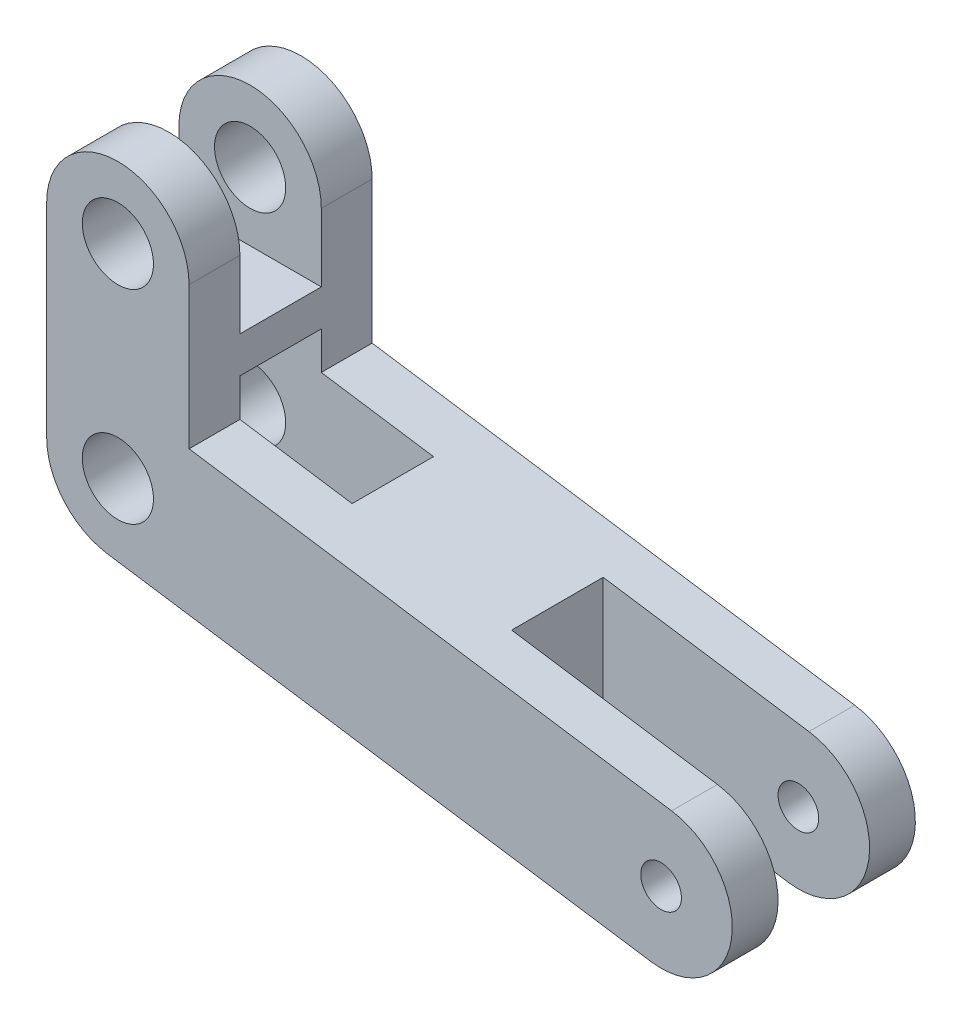
ISO-10303-21;
HEADER;
FILE_DESCRIPTION(('STEP AP214'),'2;1');
FILE_NAME('part.step','',(''),(''),'','','');
FILE_SCHEMA(('AUTOMOTIVE_DESIGN { 1 0 10303 214 1 1 1 1 }'));
ENDSEC;
DATA;
#1=APPLICATION_CONTEXT('core data for automotive mechanical design processes');
#2=APPLICATION_PROTOCOL_DEFINITION('international standard','automotive_design',2000,#1);
#3=PRODUCT_CONTEXT('',#1,'mechanical');
#4=PRODUCT('Part','Part','',(#3));
#5=PRODUCT_RELATED_PRODUCT_CATEGORY('part','',(#4));
#6=PRODUCT_DEFINITION_FORMATION('','',#4);
#7=PRODUCT_DEFINITION_CONTEXT('part definition',#1,'design');
#8=PRODUCT_DEFINITION('design','',#6,#7);
#9=PRODUCT_DEFINITION_SHAPE('','',#8);
#10=(LENGTH_UNIT() NAMED_UNIT(*) SI_UNIT(.MILLI.,.METRE.));
#11=(NAMED_UNIT(*) PLANE_ANGLE_UNIT() SI_UNIT($,.RADIAN.));
#12=(NAMED_UNIT(*) SI_UNIT($,.STERADIAN.) SOLID_ANGLE_UNIT());
#13=UNCERTAINTY_MEASURE_WITH_UNIT(LENGTH_MEASURE(1.E-05),#10,'distance_accuracy_value','');
#14=(GEOMETRIC_REPRESENTATION_CONTEXT(3) GLOBAL_UNCERTAINTY_ASSIGNED_CONTEXT((#13)) GLOBAL_UNIT_ASSIGNED_CONTEXT((#10,
#11,#12)) REPRESENTATION_CONTEXT('',''));
#15=CARTESIAN_POINT('',(0.,0.,0.));
#16=DIRECTION('',(0.,0.,1.));
#17=DIRECTION('',(1.,0.,0.));
#18=AXIS2_PLACEMENT_3D('',#15,#16,#17);
#19=CARTESIAN_POINT('',(26.7020598456374,-4.,4.5));
#20=DIRECTION('',(0.,0.,-1.));
#21=DIRECTION('',(-1.,0.,0.));
#22=AXIS2_PLACEMENT_3D('',#19,#20,#21);
#23=CYLINDRICAL_SURFACE('',#22,3.5);
#24=CARTESIAN_POINT('',(26.7020598456374,-4.,-2.25));
#25=DIRECTION('',(0.,0.,1.));
#26=DIRECTION('',(1.,0.,0.));
#27=AXIS2_PLACEMENT_3D('',#24,#25,#26);
#28=CIRCLE('',#27,3.5);
#29=CARTESIAN_POINT('',(26.1835413271189,-7.46137812813818,-2.25));
#30=VERTEX_POINT('',#29);
#31=CARTESIAN_POINT('',(27.2205783641559,-0.53862187186182,-2.25));
#32=VERTEX_POINT('',#31);
#33=EDGE_CURVE('E219',#30,#32,#28,.T.);
#34=ORIENTED_EDGE('',*,*,#33,.F.);
#35=DIRECTION('',(0.,0.,-1.));
#36=VECTOR('',#35,1.);
#37=CARTESIAN_POINT('',(26.1835413271189,-7.46137812813818,4.5));
#38=LINE('',#37,#36);
#39=CARTESIAN_POINT('',(26.1835413271189,-7.46137812813818,-4.5));
#40=VERTEX_POINT('',#39);
#41=EDGE_CURVE('E323',#30,#40,#38,.T.);
#42=ORIENTED_EDGE('',*,*,#41,.T.);
#43=CARTESIAN_POINT('',(26.7020598456374,-4.,-4.5));
#44=DIRECTION('',(0.,0.,1.));
#45=DIRECTION('',(1.,0.,0.));
#46=AXIS2_PLACEMENT_3D('',#43,#44,#45);
#47=CIRCLE('',#46,3.5);
#48=CARTESIAN_POINT('',(27.2205783641559,-0.538621871861821,-4.5));
#49=VERTEX_POINT('',#48);
#50=EDGE_CURVE('E304',#40,#49,#47,.T.);
#51=ORIENTED_EDGE('',*,*,#50,.T.);
#52=DIRECTION('',(0.,0.,-1.));
#53=VECTOR('',#52,1.);
#54=CARTESIAN_POINT('',(27.2205783641559,-0.538621871861821,4.5));
#55=LINE('',#54,#53);
#56=EDGE_CURVE('E366',#32,#49,#55,.T.);
#57=ORIENTED_EDGE('',*,*,#56,.F.);
#58=EDGE_LOOP('',(#34,#42,#51,#57));
#59=FACE_BOUND('',#58,.T.);
#60=ADVANCED_FACE('F41',(#59),#23,.T.);
#61=CARTESIAN_POINT('',(27.2205783641559,-0.538621871861821,4.5));
#62=DIRECTION('',(-0.148148148148148,-0.988965179468051,0.));
#63=DIRECTION('',(0.988965179468051,-0.148148148148148,0.));
#64=AXIS2_PLACEMENT_3D('',#61,#62,#63);
#65=PLANE('',#64);
#66=DIRECTION('',(-0.988965179468051,0.148148148148148,0.));
#67=VECTOR('',#66,1.);
#68=CARTESIAN_POINT('',(27.2205783641559,-0.538621871861821,-2.25));
#69=LINE('',#68,#67);
#70=CARTESIAN_POINT('',(17.108650588572,0.976156813234416,-2.25));
#71=VERTEX_POINT('',#70);
#72=EDGE_CURVE('E201',#32,#71,#69,.T.);
#73=ORIENTED_EDGE('',*,*,#72,.F.);
#74=ORIENTED_EDGE('',*,*,#56,.T.);
#75=DIRECTION('',(-0.988965179468051,0.148148148148148,0.));
#76=VECTOR('',#75,1.);
#77=CARTESIAN_POINT('',(27.2205783641559,-0.538621871861821,-4.5));
#78=LINE('',#77,#76);
#79=CARTESIAN_POINT('',(3.5,3.01474869224938,-4.5));
#80=VERTEX_POINT('',#79);
#81=EDGE_CURVE('E326',#49,#80,#78,.T.);
#82=ORIENTED_EDGE('',*,*,#81,.T.);
#83=DIRECTION('',(0.,0.,-1.));
#84=VECTOR('',#83,1.);
#85=CARTESIAN_POINT('',(3.5,3.01474869224938,4.5));
#86=LINE('',#85,#84);
#87=CARTESIAN_POINT('',(3.5,3.01474869224938,-2.));
#88=VERTEX_POINT('',#87);
#89=EDGE_CURVE('E362',#88,#80,#86,.T.);
#90=ORIENTED_EDGE('',*,*,#89,.F.);
#91=DIRECTION('',(0.988965179468051,-0.148148148148148,0.));
#92=VECTOR('',#91,1.);
#93=CARTESIAN_POINT('',(27.2205783641559,-0.538621871861821,-2.));
#94=LINE('',#93,#92);
#95=CARTESIAN_POINT('',(9.01483292771079,2.18862022731572,-2.));
#96=VERTEX_POINT('',#95);
#97=EDGE_CURVE('E279',#88,#96,#94,.T.);
#98=ORIENTED_EDGE('',*,*,#97,.T.);
#99=DIRECTION('',(0.,0.,1.));
#100=VECTOR('',#99,1.);
#101=CARTESIAN_POINT('',(9.01483292771079,2.18862022731572,4.5));
#102=LINE('',#101,#100);
#103=CARTESIAN_POINT('',(9.01483292771079,2.18862022731572,2.));
#104=VERTEX_POINT('',#103);
#105=EDGE_CURVE('E282',#96,#104,#102,.T.);
#106=ORIENTED_EDGE('',*,*,#105,.T.);
#107=DIRECTION('',(0.988965179468051,-0.148148148148148,0.));
#108=VECTOR('',#107,1.);
#109=CARTESIAN_POINT('',(27.2205783641559,-0.538621871861821,2.));
#110=LINE('',#109,#108);
#111=CARTESIAN_POINT('',(3.5,3.01474869224938,2.));
#112=VERTEX_POINT('',#111);
#113=EDGE_CURVE('E264',#112,#104,#110,.T.);
#114=ORIENTED_EDGE('',*,*,#113,.F.);
#115=CARTESIAN_POINT('',(3.5,3.01474869224938,4.5));
#116=VERTEX_POINT('',#115);
#117=EDGE_CURVE('E363',#116,#112,#86,.T.);
#118=ORIENTED_EDGE('',*,*,#117,.F.);
#119=DIRECTION('',(-0.988965179468051,0.148148148148148,0.));
#120=VECTOR('',#119,1.);
#121=CARTESIAN_POINT('',(27.2205783641559,-0.538621871861821,4.5));
#122=LINE('',#121,#120);
#123=CARTESIAN_POINT('',(27.2205783641559,-0.538621871861821,4.5));
#124=VERTEX_POINT('',#123);
#125=EDGE_CURVE('E310',#124,#116,#122,.T.);
#126=ORIENTED_EDGE('',*,*,#125,.F.);
#127=CARTESIAN_POINT('',(27.2205783641559,-0.53862187186182,2.25));
#128=VERTEX_POINT('',#127);
#129=EDGE_CURVE('E210',#124,#128,#55,.T.);
#130=ORIENTED_EDGE('',*,*,#129,.T.);
#131=DIRECTION('',(-0.988965179468051,0.148148148148148,0.));
#132=VECTOR('',#131,1.);
#133=CARTESIAN_POINT('',(27.2205783641559,-0.538621871861821,2.25));
#134=LINE('',#133,#132);
#135=CARTESIAN_POINT('',(17.108650588572,0.976156813234416,2.25));
#136=VERTEX_POINT('',#135);
#137=EDGE_CURVE('E204',#128,#136,#134,.T.);
#138=ORIENTED_EDGE('',*,*,#137,.T.);
#139=DIRECTION('',(0.,0.,-1.));
#140=VECTOR('',#139,1.);
#141=CARTESIAN_POINT('',(17.108650588572,0.976156813234419,4.5));
#142=LINE('',#141,#140);
#143=EDGE_CURVE('E191',#136,#71,#142,.T.);
#144=ORIENTED_EDGE('',*,*,#143,.T.);
#145=EDGE_LOOP('',(#73,#74,#82,#90,#98,#106,#114,#118,#126,#130,#138,#144));
#146=FACE_BOUND('',#145,.T.);
#147=ADVANCED_FACE('F208',(#146),#65,.F.);
#148=CARTESIAN_POINT('',(26.1835413271189,-7.46137812813818,4.5));
#149=DIRECTION('',(0.148148148148148,0.988965179468051,0.));
#150=DIRECTION('',(-0.988965179468051,0.148148148148148,0.));
#151=AXIS2_PLACEMENT_3D('',#148,#149,#150);
#152=PLANE('',#151);
#153=DIRECTION('',(0.988965179468051,-0.148148148148148,0.));
#154=VECTOR('',#153,1.);
#155=CARTESIAN_POINT('',(26.1835413271189,-7.46137812813818,-2.25));
#156=LINE('',#155,#154);
#157=CARTESIAN_POINT('',(17.108650588572,-6.10194881204674,-2.25));
#158=VERTEX_POINT('',#157);
#159=EDGE_CURVE('E214',#158,#30,#156,.T.);
#160=ORIENTED_EDGE('',*,*,#159,.F.);
#161=DIRECTION('',(0.,0.,1.));
#162=VECTOR('',#161,1.);
#163=CARTESIAN_POINT('',(17.108650588572,-6.10194881204674,4.5));
#164=LINE('',#163,#162);
#165=CARTESIAN_POINT('',(17.108650588572,-6.10194881204674,2.25));
#166=VERTEX_POINT('',#165);
#167=EDGE_CURVE('E11',#158,#166,#164,.T.);
#168=ORIENTED_EDGE('',*,*,#167,.T.);
#169=DIRECTION('',(0.988965179468051,-0.148148148148148,0.));
#170=VECTOR('',#169,1.);
#171=CARTESIAN_POINT('',(26.1835413271189,-7.46137812813818,2.25));
#172=LINE('',#171,#170);
#173=CARTESIAN_POINT('',(26.1835413271189,-7.46137812813818,2.25));
#174=VERTEX_POINT('',#173);
#175=EDGE_CURVE('E205',#166,#174,#172,.T.);
#176=ORIENTED_EDGE('',*,*,#175,.T.);
#177=CARTESIAN_POINT('',(26.1835413271189,-7.46137812813818,4.5));
#178=VERTEX_POINT('',#177);
#179=EDGE_CURVE('E343',#178,#174,#38,.T.);
#180=ORIENTED_EDGE('',*,*,#179,.F.);
#181=DIRECTION('',(0.988965179468051,-0.148148148148148,0.));
#182=VECTOR('',#181,1.);
#183=CARTESIAN_POINT('',(26.1835413271189,-7.46137812813818,4.5));
#184=LINE('',#183,#182);
#185=CARTESIAN_POINT('',(-0.518518518518519,-3.46137812813818,4.5));
#186=VERTEX_POINT('',#185);
#187=EDGE_CURVE('E321',#186,#178,#184,.T.);
#188=ORIENTED_EDGE('',*,*,#187,.F.);
#189=DIRECTION('',(0.,0.,-1.));
#190=VECTOR('',#189,1.);
#191=CARTESIAN_POINT('',(-0.518518518518519,-3.46137812813818,4.5));
#192=LINE('',#191,#190);
#193=CARTESIAN_POINT('',(-0.518518518518522,-3.46137812813818,2.));
#194=VERTEX_POINT('',#193);
#195=EDGE_CURVE('E347',#186,#194,#192,.T.);
#196=ORIENTED_EDGE('',*,*,#195,.T.);
#197=DIRECTION('',(-0.988965179468051,0.148148148148148,0.));
#198=VECTOR('',#197,1.);
#199=CARTESIAN_POINT('',(26.1835413271189,-7.46137812813818,2.));
#200=LINE('',#199,#198);
#201=CARTESIAN_POINT('',(9.01483292771079,-4.88948539796544,2.));
#202=VERTEX_POINT('',#201);
#203=EDGE_CURVE('E256',#202,#194,#200,.T.);
#204=ORIENTED_EDGE('',*,*,#203,.F.);
#205=DIRECTION('',(0.,0.,-1.));
#206=VECTOR('',#205,1.);
#207=CARTESIAN_POINT('',(9.01483292771079,-4.88948539796544,4.5));
#208=LINE('',#207,#206);
#209=CARTESIAN_POINT('',(9.01483292771079,-4.88948539796544,-2.));
#210=VERTEX_POINT('',#209);
#211=EDGE_CURVE('E368',#202,#210,#208,.T.);
#212=ORIENTED_EDGE('',*,*,#211,.T.);
#213=DIRECTION('',(-0.988965179468051,0.148148148148148,0.));
#214=VECTOR('',#213,1.);
#215=CARTESIAN_POINT('',(26.1835413271189,-7.46137812813818,-2.));
#216=LINE('',#215,#214);
#217=CARTESIAN_POINT('',(-0.518518518518522,-3.46137812813818,-2.));
#218=VERTEX_POINT('',#217);
#219=EDGE_CURVE('E267',#210,#218,#216,.T.);
#220=ORIENTED_EDGE('',*,*,#219,.T.);
#221=CARTESIAN_POINT('',(-0.518518518518519,-3.46137812813818,-4.5));
#222=VERTEX_POINT('',#221);
#223=EDGE_CURVE('E346',#218,#222,#192,.T.);
#224=ORIENTED_EDGE('',*,*,#223,.T.);
#225=DIRECTION('',(0.988965179468051,-0.148148148148148,0.));
#226=VECTOR('',#225,1.);
#227=CARTESIAN_POINT('',(26.1835413271189,-7.46137812813818,-4.5));
#228=LINE('',#227,#226);
#229=EDGE_CURVE('E311',#222,#40,#228,.T.);
#230=ORIENTED_EDGE('',*,*,#229,.T.);
#231=ORIENTED_EDGE('',*,*,#41,.F.);
#232=EDGE_LOOP('',(#160,#168,#176,#180,#188,#196,#204,#212,#220,#224,#230,#231));
#233=FACE_BOUND('',#232,.T.);
#234=ADVANCED_FACE('F395',(#233),#152,.F.);
#235=CARTESIAN_POINT('',(26.7020598456374,-4.,4.5));
#236=DIRECTION('',(0.,0.,-1.));
#237=DIRECTION('',(-1.,0.,0.));
#238=AXIS2_PLACEMENT_3D('',#235,#236,#237);
#239=CYLINDRICAL_SURFACE('',#238,0.999999999999998);
#240=CARTESIAN_POINT('',(26.7020598456374,-4.,-4.5));
#241=DIRECTION('',(0.,0.,1.));
#242=DIRECTION('',(1.,0.,0.));
#243=AXIS2_PLACEMENT_3D('',#240,#241,#242);
#244=CIRCLE('',#243,0.999999999999998);
#245=CARTESIAN_POINT('',(27.7020598456374,-4.,-4.5));
#246=VERTEX_POINT('',#245);
#247=EDGE_CURVE('E292',#246,#246,#244,.T.);
#248=ORIENTED_EDGE('',*,*,#247,.F.);
#249=EDGE_LOOP('',(#248));
#250=FACE_BOUND('',#249,.T.);
#251=CARTESIAN_POINT('',(26.7020598456374,-4.,-2.25));
#252=DIRECTION('',(0.,0.,1.));
#253=DIRECTION('',(1.,0.,0.));
#254=AXIS2_PLACEMENT_3D('',#251,#252,#253);
#255=CIRCLE('',#254,0.999999999999998);
#256=CARTESIAN_POINT('',(27.7020598456374,-4.,-2.25));
#257=VERTEX_POINT('',#256);
#258=EDGE_CURVE('E211',#257,#257,#255,.T.);
#259=ORIENTED_EDGE('',*,*,#258,.T.);
#260=EDGE_LOOP('',(#259));
#261=FACE_BOUND('',#260,.T.);
#262=ADVANCED_FACE('F470',(#250,#261),#239,.F.);
#263=CARTESIAN_POINT('',(3.5,10.,4.5));
#264=DIRECTION('',(-1.,0.,0.));
#265=DIRECTION('',(0.,-1.,0.));
#266=AXIS2_PLACEMENT_3D('',#263,#264,#265);
#267=PLANE('',#266);
#268=DIRECTION('',(0.,1.,0.));
#269=VECTOR('',#268,1.);
#270=CARTESIAN_POINT('',(3.5,16.4698635435501,-2.));
#271=LINE('',#270,#269);
#272=CARTESIAN_POINT('',(3.5,6.65669603838257,-2.));
#273=VERTEX_POINT('',#272);
#274=CARTESIAN_POINT('',(3.5,10.,-2.));
#275=VERTEX_POINT('',#274);
#276=EDGE_CURVE('E224',#273,#275,#271,.T.);
#277=ORIENTED_EDGE('',*,*,#276,.F.);
#278=DIRECTION('',(0.,0.,1.));
#279=VECTOR('',#278,1.);
#280=CARTESIAN_POINT('',(3.5,6.65669603838257,-2.));
#281=LINE('',#280,#279);
#282=CARTESIAN_POINT('',(3.5,6.65669603838257,2.));
#283=VERTEX_POINT('',#282);
#284=EDGE_CURVE('E227',#273,#283,#281,.T.);
#285=ORIENTED_EDGE('',*,*,#284,.T.);
#286=DIRECTION('',(0.,1.,0.));
#287=VECTOR('',#286,1.);
#288=CARTESIAN_POINT('',(3.5,16.4698635435501,2.));
#289=LINE('',#288,#287);
#290=CARTESIAN_POINT('',(3.5,10.,2.));
#291=VERTEX_POINT('',#290);
#292=EDGE_CURVE('E225',#283,#291,#289,.T.);
#293=ORIENTED_EDGE('',*,*,#292,.T.);
#294=DIRECTION('',(0.,0.,-1.));
#295=VECTOR('',#294,1.);
#296=CARTESIAN_POINT('',(3.5,10.,4.5));
#297=LINE('',#296,#295);
#298=CARTESIAN_POINT('',(3.5,10.,4.5));
#299=VERTEX_POINT('',#298);
#300=EDGE_CURVE('E359',#299,#291,#297,.T.);
#301=ORIENTED_EDGE('',*,*,#300,.F.);
#302=DIRECTION('',(0.,1.,0.));
#303=VECTOR('',#302,1.);
#304=CARTESIAN_POINT('',(3.5,10.,4.5));
#305=LINE('',#304,#303);
#306=EDGE_CURVE('E313',#116,#299,#305,.T.);
#307=ORIENTED_EDGE('',*,*,#306,.F.);
#308=ORIENTED_EDGE('',*,*,#117,.T.);
#309=DIRECTION('',(0.,-1.,0.));
#310=VECTOR('',#309,1.);
#311=CARTESIAN_POINT('',(3.5,10.,2.));
#312=LINE('',#311,#310);
#313=CARTESIAN_POINT('',(3.5,4.86934920884361,2.));
#314=VERTEX_POINT('',#313);
#315=EDGE_CURVE('E262',#314,#112,#312,.T.);
#316=ORIENTED_EDGE('',*,*,#315,.F.);
#317=DIRECTION('',(0.,0.,-1.));
#318=VECTOR('',#317,1.);
#319=CARTESIAN_POINT('',(3.5,4.86934920884361,4.5));
#320=LINE('',#319,#318);
#321=CARTESIAN_POINT('',(3.5,4.86934920884361,-2.));
#322=VERTEX_POINT('',#321);
#323=EDGE_CURVE('E285',#314,#322,#320,.T.);
#324=ORIENTED_EDGE('',*,*,#323,.T.);
#325=DIRECTION('',(0.,-1.,0.));
#326=VECTOR('',#325,1.);
#327=CARTESIAN_POINT('',(3.5,10.,-2.));
#328=LINE('',#327,#326);
#329=EDGE_CURVE('E276',#322,#88,#328,.T.);
#330=ORIENTED_EDGE('',*,*,#329,.T.);
#331=ORIENTED_EDGE('',*,*,#89,.T.);
#332=DIRECTION('',(0.,1.,0.));
#333=VECTOR('',#332,1.);
#334=CARTESIAN_POINT('',(3.5,10.,-4.5));
#335=LINE('',#334,#333);
#336=CARTESIAN_POINT('',(3.5,10.,-4.5));
#337=VERTEX_POINT('',#336);
#338=EDGE_CURVE('E329',#80,#337,#335,.T.);
#339=ORIENTED_EDGE('',*,*,#338,.T.);
#340=EDGE_CURVE('E358',#275,#337,#297,.T.);
#341=ORIENTED_EDGE('',*,*,#340,.F.);
#342=EDGE_LOOP('',(#277,#285,#293,#301,#307,#308,#316,#324,#330,#331,#339,#341));
#343=FACE_BOUND('',#342,.T.);
#344=ADVANCED_FACE('F411',(#343),#267,.F.);
#345=CARTESIAN_POINT('',(0.,10.,4.5));
#346=DIRECTION('',(0.,0.,-1.));
#347=DIRECTION('',(-1.,0.,0.));
#348=AXIS2_PLACEMENT_3D('',#345,#346,#347);
#349=CYLINDRICAL_SURFACE('',#348,3.5);
#350=CARTESIAN_POINT('',(0.,10.,-2.));
#351=DIRECTION('',(0.,0.,1.));
#352=DIRECTION('',(1.,0.,0.));
#353=AXIS2_PLACEMENT_3D('',#350,#351,#352);
#354=CIRCLE('',#353,3.5);
#355=CARTESIAN_POINT('',(-3.5,10.,-2.));
#356=VERTEX_POINT('',#355);
#357=EDGE_CURVE('E253',#275,#356,#354,.T.);
#358=ORIENTED_EDGE('',*,*,#357,.F.);
#359=ORIENTED_EDGE('',*,*,#340,.T.);
#360=CARTESIAN_POINT('',(0.,10.,-4.5));
#361=DIRECTION('',(0.,0.,1.));
#362=DIRECTION('',(1.,0.,0.));
#363=AXIS2_PLACEMENT_3D('',#360,#361,#362);
#364=CIRCLE('',#363,3.5);
#365=CARTESIAN_POINT('',(-3.5,10.,-4.5));
#366=VERTEX_POINT('',#365);
#367=EDGE_CURVE('E332',#337,#366,#364,.T.);
#368=ORIENTED_EDGE('',*,*,#367,.T.);
#369=DIRECTION('',(0.,0.,-1.));
#370=VECTOR('',#369,1.);
#371=CARTESIAN_POINT('',(-3.5,10.,4.5));
#372=LINE('',#371,#370);
#373=EDGE_CURVE('E354',#356,#366,#372,.T.);
#374=ORIENTED_EDGE('',*,*,#373,.F.);
#375=EDGE_LOOP('',(#358,#359,#368,#374));
#376=FACE_BOUND('',#375,.T.);
#377=ADVANCED_FACE('F459',(#376),#349,.T.);
#378=CARTESIAN_POINT('',(-3.5,10.,4.5));
#379=DIRECTION('',(1.,0.,0.));
#380=DIRECTION('',(0.,1.,0.));
#381=AXIS2_PLACEMENT_3D('',#378,#379,#380);
#382=PLANE('',#381);
#383=DIRECTION('',(0.,-1.,0.));
#384=VECTOR('',#383,1.);
#385=CARTESIAN_POINT('',(-3.5,10.,-2.));
#386=LINE('',#385,#384);
#387=CARTESIAN_POINT('',(-3.5,6.65669603838257,-2.));
#388=VERTEX_POINT('',#387);
#389=EDGE_CURVE('E251',#356,#388,#386,.T.);
#390=ORIENTED_EDGE('',*,*,#389,.F.);
#391=ORIENTED_EDGE('',*,*,#373,.T.);
#392=DIRECTION('',(0.,-1.,0.));
#393=VECTOR('',#392,1.);
#394=CARTESIAN_POINT('',(-3.5,10.,-4.5));
#395=LINE('',#394,#393);
#396=CARTESIAN_POINT('',(-3.5,0.,-4.5));
#397=VERTEX_POINT('',#396);
#398=EDGE_CURVE('E335',#366,#397,#395,.T.);
#399=ORIENTED_EDGE('',*,*,#398,.T.);
#400=DIRECTION('',(0.,0.,-1.));
#401=VECTOR('',#400,1.);
#402=CARTESIAN_POINT('',(-3.5,0.,4.5));
#403=LINE('',#402,#401);
#404=CARTESIAN_POINT('',(-3.5,0.,-2.));
#405=VERTEX_POINT('',#404);
#406=EDGE_CURVE('E350',#405,#397,#403,.T.);
#407=ORIENTED_EDGE('',*,*,#406,.F.);
#408=DIRECTION('',(0.,1.,0.));
#409=VECTOR('',#408,1.);
#410=CARTESIAN_POINT('',(-3.5,10.,-2.));
#411=LINE('',#410,#409);
#412=CARTESIAN_POINT('',(-3.5,4.86934920884361,-2.));
#413=VERTEX_POINT('',#412);
#414=EDGE_CURVE('E273',#405,#413,#411,.T.);
#415=ORIENTED_EDGE('',*,*,#414,.T.);
#416=DIRECTION('',(0.,0.,1.));
#417=VECTOR('',#416,1.);
#418=CARTESIAN_POINT('',(-3.5,4.86934920884361,4.5));
#419=LINE('',#418,#417);
#420=CARTESIAN_POINT('',(-3.5,4.86934920884361,2.));
#421=VERTEX_POINT('',#420);
#422=EDGE_CURVE('E379',#413,#421,#419,.T.);
#423=ORIENTED_EDGE('',*,*,#422,.T.);
#424=DIRECTION('',(0.,1.,0.));
#425=VECTOR('',#424,1.);
#426=CARTESIAN_POINT('',(-3.5,10.,2.));
#427=LINE('',#426,#425);
#428=CARTESIAN_POINT('',(-3.5,0.,2.));
#429=VERTEX_POINT('',#428);
#430=EDGE_CURVE('E260',#429,#421,#427,.T.);
#431=ORIENTED_EDGE('',*,*,#430,.F.);
#432=CARTESIAN_POINT('',(-3.5,0.,4.5));
#433=VERTEX_POINT('',#432);
#434=EDGE_CURVE('E351',#433,#429,#403,.T.);
#435=ORIENTED_EDGE('',*,*,#434,.F.);
#436=DIRECTION('',(0.,-1.,0.));
#437=VECTOR('',#436,1.);
#438=CARTESIAN_POINT('',(-3.5,10.,4.5));
#439=LINE('',#438,#437);
#440=CARTESIAN_POINT('',(-3.5,10.,4.5));
#441=VERTEX_POINT('',#440);
#442=EDGE_CURVE('E317',#441,#433,#439,.T.);
#443=ORIENTED_EDGE('',*,*,#442,.F.);
#444=CARTESIAN_POINT('',(-3.5,10.,2.));
#445=VERTEX_POINT('',#444);
#446=EDGE_CURVE('E355',#441,#445,#372,.T.);
#447=ORIENTED_EDGE('',*,*,#446,.T.);
#448=DIRECTION('',(0.,-1.,0.));
#449=VECTOR('',#448,1.);
#450=CARTESIAN_POINT('',(-3.5,10.,2.));
#451=LINE('',#450,#449);
#452=CARTESIAN_POINT('',(-3.5,6.65669603838257,2.));
#453=VERTEX_POINT('',#452);
#454=EDGE_CURVE('E244',#445,#453,#451,.T.);
#455=ORIENTED_EDGE('',*,*,#454,.T.);
#456=DIRECTION('',(0.,0.,-1.));
#457=VECTOR('',#456,1.);
#458=CARTESIAN_POINT('',(-3.5,6.65669603838257,4.5));
#459=LINE('',#458,#457);
#460=EDGE_CURVE('E49',#453,#388,#459,.T.);
#461=ORIENTED_EDGE('',*,*,#460,.T.);
#462=EDGE_LOOP('',(#390,#391,#399,#407,#415,#423,#431,#435,#443,#447,#455,#461));
#463=FACE_BOUND('',#462,.T.);
#464=ADVANCED_FACE('F434',(#463),#382,.F.);
#465=CARTESIAN_POINT('',(0.,0.,4.5));
#466=DIRECTION('',(0.,0.,-1.));
#467=DIRECTION('',(-1.,0.,0.));
#468=AXIS2_PLACEMENT_3D('',#465,#466,#467);
#469=CYLINDRICAL_SURFACE('',#468,3.5);
#470=CARTESIAN_POINT('',(0.,0.,2.));
#471=DIRECTION('',(0.,0.,-1.));
#472=DIRECTION('',(-1.,0.,0.));
#473=AXIS2_PLACEMENT_3D('',#470,#471,#472);
#474=CIRCLE('',#473,3.5);
#475=EDGE_CURVE('E258',#194,#429,#474,.T.);
#476=ORIENTED_EDGE('',*,*,#475,.F.);
#477=ORIENTED_EDGE('',*,*,#195,.F.);
#478=CARTESIAN_POINT('',(0.,0.,4.5));
#479=DIRECTION('',(0.,0.,1.));
#480=DIRECTION('',(1.,0.,0.));
#481=AXIS2_PLACEMENT_3D('',#478,#479,#480);
#482=CIRCLE('',#481,3.5);
#483=EDGE_CURVE('E319',#433,#186,#482,.T.);
#484=ORIENTED_EDGE('',*,*,#483,.F.);
#485=ORIENTED_EDGE('',*,*,#434,.T.);
#486=EDGE_LOOP('',(#476,#477,#484,#485));
#487=FACE_BOUND('',#486,.T.);
#488=ADVANCED_FACE('F428',(#487),#469,.T.);
#489=CARTESIAN_POINT('',(0.,0.,4.5));
#490=DIRECTION('',(0.,0.,-1.));
#491=DIRECTION('',(-1.,0.,0.));
#492=AXIS2_PLACEMENT_3D('',#489,#490,#491);
#493=CYLINDRICAL_SURFACE('',#492,1.75);
#494=CARTESIAN_POINT('',(0.,0.,4.5));
#495=DIRECTION('',(0.,0.,1.));
#496=DIRECTION('',(1.,0.,0.));
#497=AXIS2_PLACEMENT_3D('',#494,#495,#496);
#498=CIRCLE('',#497,1.75);
#499=CARTESIAN_POINT('',(1.75,0.,4.5));
#500=VERTEX_POINT('',#499);
#501=EDGE_CURVE('E301',#500,#500,#498,.T.);
#502=ORIENTED_EDGE('',*,*,#501,.T.);
#503=EDGE_LOOP('',(#502));
#504=FACE_BOUND('',#503,.T.);
#505=CARTESIAN_POINT('',(0.,0.,2.));
#506=DIRECTION('',(0.,0.,-1.));
#507=DIRECTION('',(-1.,0.,0.));
#508=AXIS2_PLACEMENT_3D('',#505,#506,#507);
#509=CIRCLE('',#508,1.75);
#510=CARTESIAN_POINT('',(-1.75,0.,2.));
#511=VERTEX_POINT('',#510);
#512=EDGE_CURVE('E255',#511,#511,#509,.T.);
#513=ORIENTED_EDGE('',*,*,#512,.T.);
#514=EDGE_LOOP('',(#513));
#515=FACE_BOUND('',#514,.T.);
#516=ADVANCED_FACE('F489',(#504,#515),#493,.F.);
#517=CARTESIAN_POINT('',(0.,10.,4.5));
#518=DIRECTION('',(0.,0.,-1.));
#519=DIRECTION('',(-1.,0.,0.));
#520=AXIS2_PLACEMENT_3D('',#517,#518,#519);
#521=CYLINDRICAL_SURFACE('',#520,1.75);
#522=CARTESIAN_POINT('',(0.,10.,-4.5));
#523=DIRECTION('',(0.,0.,1.));
#524=DIRECTION('',(1.,0.,0.));
#525=AXIS2_PLACEMENT_3D('',#522,#523,#524);
#526=CIRCLE('',#525,1.75);
#527=CARTESIAN_POINT('',(1.75,10.,-4.5));
#528=VERTEX_POINT('',#527);
#529=EDGE_CURVE('E288',#528,#528,#526,.T.);
#530=ORIENTED_EDGE('',*,*,#529,.F.);
#531=EDGE_LOOP('',(#530));
#532=FACE_BOUND('',#531,.T.);
#533=CARTESIAN_POINT('',(0.,10.,-2.));
#534=DIRECTION('',(0.,0.,1.));
#535=DIRECTION('',(1.,0.,0.));
#536=AXIS2_PLACEMENT_3D('',#533,#534,#535);
#537=CIRCLE('',#536,1.75);
#538=CARTESIAN_POINT('',(1.75,10.,-2.));
#539=VERTEX_POINT('',#538);
#540=EDGE_CURVE('E250',#539,#539,#537,.T.);
#541=ORIENTED_EDGE('',*,*,#540,.T.);
#542=EDGE_LOOP('',(#541));
#543=FACE_BOUND('',#542,.T.);
#544=ADVANCED_FACE('F483',(#532,#543),#521,.F.);
#545=CARTESIAN_POINT('',(26.7020598456374,-4.,4.5));
#546=DIRECTION('',(0.,0.,1.));
#547=DIRECTION('',(1.,0.,0.));
#548=AXIS2_PLACEMENT_3D('',#545,#546,#547);
#549=PLANE('',#548);
#550=CARTESIAN_POINT('',(26.7020598456374,-4.,4.5));
#551=DIRECTION('',(0.,0.,1.));
#552=DIRECTION('',(1.,0.,0.));
#553=AXIS2_PLACEMENT_3D('',#550,#551,#552);
#554=CIRCLE('',#553,0.999999999999998);
#555=CARTESIAN_POINT('',(27.7020598456374,-4.,4.5));
#556=VERTEX_POINT('',#555);
#557=EDGE_CURVE('E295',#556,#556,#554,.T.);
#558=ORIENTED_EDGE('',*,*,#557,.F.);
#559=EDGE_LOOP('',(#558));
#560=FACE_BOUND('',#559,.T.);
#561=CARTESIAN_POINT('',(26.7020598456374,-4.,4.5));
#562=DIRECTION('',(0.,0.,1.));
#563=DIRECTION('',(1.,0.,0.));
#564=AXIS2_PLACEMENT_3D('',#561,#562,#563);
#565=CIRCLE('',#564,3.5);
#566=EDGE_CURVE('E307',#178,#124,#565,.T.);
#567=ORIENTED_EDGE('',*,*,#566,.T.);
#568=ORIENTED_EDGE('',*,*,#125,.T.);
#569=ORIENTED_EDGE('',*,*,#306,.T.);
#570=CARTESIAN_POINT('',(0.,10.,4.5));
#571=DIRECTION('',(0.,0.,1.));
#572=DIRECTION('',(1.,0.,0.));
#573=AXIS2_PLACEMENT_3D('',#570,#571,#572);
#574=CIRCLE('',#573,3.5);
#575=EDGE_CURVE('E315',#299,#441,#574,.T.);
#576=ORIENTED_EDGE('',*,*,#575,.T.);
#577=ORIENTED_EDGE('',*,*,#442,.T.);
#578=ORIENTED_EDGE('',*,*,#483,.T.);
#579=ORIENTED_EDGE('',*,*,#187,.T.);
#580=EDGE_LOOP('',(#567,#568,#569,#576,#577,#578,#579));
#581=FACE_BOUND('',#580,.T.);
#582=ORIENTED_EDGE('',*,*,#501,.F.);
#583=EDGE_LOOP('',(#582));
#584=FACE_BOUND('',#583,.T.);
#585=CARTESIAN_POINT('',(0.,10.,4.5));
#586=DIRECTION('',(0.,0.,1.));
#587=DIRECTION('',(1.,0.,0.));
#588=AXIS2_PLACEMENT_3D('',#585,#586,#587);
#589=CIRCLE('',#588,1.75);
#590=CARTESIAN_POINT('',(1.75,10.,4.5));
#591=VERTEX_POINT('',#590);
#592=EDGE_CURVE('E289',#591,#591,#589,.T.);
#593=ORIENTED_EDGE('',*,*,#592,.F.);
#594=EDGE_LOOP('',(#593));
#595=FACE_BOUND('',#594,.T.);
#596=ADVANCED_FACE('F443',(#560,#581,#584,#595),#549,.T.);
#597=CARTESIAN_POINT('',(26.7020598456374,-4.,-4.5));
#598=DIRECTION('',(0.,0.,1.));
#599=DIRECTION('',(1.,0.,0.));
#600=AXIS2_PLACEMENT_3D('',#597,#598,#599);
#601=PLANE('',#600);
#602=ORIENTED_EDGE('',*,*,#50,.F.);
#603=ORIENTED_EDGE('',*,*,#229,.F.);
#604=CARTESIAN_POINT('',(0.,0.,-4.5));
#605=DIRECTION('',(0.,0.,1.));
#606=DIRECTION('',(1.,0.,0.));
#607=AXIS2_PLACEMENT_3D('',#604,#605,#606);
#608=CIRCLE('',#607,3.5);
#609=EDGE_CURVE('E338',#397,#222,#608,.T.);
#610=ORIENTED_EDGE('',*,*,#609,.F.);
#611=ORIENTED_EDGE('',*,*,#398,.F.);
#612=ORIENTED_EDGE('',*,*,#367,.F.);
#613=ORIENTED_EDGE('',*,*,#338,.F.);
#614=ORIENTED_EDGE('',*,*,#81,.F.);
#615=EDGE_LOOP('',(#602,#603,#610,#611,#612,#613,#614));
#616=FACE_BOUND('',#615,.T.);
#617=CARTESIAN_POINT('',(0.,0.,-4.5));
#618=DIRECTION('',(0.,0.,1.));
#619=DIRECTION('',(1.,0.,0.));
#620=AXIS2_PLACEMENT_3D('',#617,#618,#619);
#621=CIRCLE('',#620,1.75);
#622=CARTESIAN_POINT('',(1.75,0.,-4.5));
#623=VERTEX_POINT('',#622);
#624=EDGE_CURVE('E298',#623,#623,#621,.T.);
#625=ORIENTED_EDGE('',*,*,#624,.T.);
#626=EDGE_LOOP('',(#625));
#627=FACE_BOUND('',#626,.T.);
#628=ORIENTED_EDGE('',*,*,#247,.T.);
#629=EDGE_LOOP('',(#628));
#630=FACE_BOUND('',#629,.T.);
#631=ORIENTED_EDGE('',*,*,#529,.T.);
#632=EDGE_LOOP('',(#631));
#633=FACE_BOUND('',#632,.T.);
#634=ADVANCED_FACE('F404',(#616,#627,#630,#633),#601,.F.);
#635=ORIENTED_EDGE('',*,*,#179,.T.);
#636=CARTESIAN_POINT('',(26.7020598456374,-4.,2.25));
#637=DIRECTION('',(0.,0.,1.));
#638=DIRECTION('',(1.,0.,0.));
#639=AXIS2_PLACEMENT_3D('',#636,#637,#638);
#640=CIRCLE('',#639,3.5);
#641=EDGE_CURVE('E56',#174,#128,#640,.T.);
#642=ORIENTED_EDGE('',*,*,#641,.T.);
#643=ORIENTED_EDGE('',*,*,#129,.F.);
#644=ORIENTED_EDGE('',*,*,#566,.F.);
#645=EDGE_LOOP('',(#635,#642,#643,#644));
#646=FACE_BOUND('',#645,.T.);
#647=ADVANCED_FACE('F43',(#646),#23,.T.);
#648=ORIENTED_EDGE('',*,*,#300,.T.);
#649=CARTESIAN_POINT('',(0.,10.,2.));
#650=DIRECTION('',(0.,0.,1.));
#651=DIRECTION('',(1.,0.,0.));
#652=AXIS2_PLACEMENT_3D('',#649,#650,#651);
#653=CIRCLE('',#652,3.5);
#654=EDGE_CURVE('E247',#291,#445,#653,.T.);
#655=ORIENTED_EDGE('',*,*,#654,.T.);
#656=ORIENTED_EDGE('',*,*,#446,.F.);
#657=ORIENTED_EDGE('',*,*,#575,.F.);
#658=EDGE_LOOP('',(#648,#655,#656,#657));
#659=FACE_BOUND('',#658,.T.);
#660=ADVANCED_FACE('F450',(#659),#349,.T.);
#661=ORIENTED_EDGE('',*,*,#223,.F.);
#662=CARTESIAN_POINT('',(0.,0.,-2.));
#663=DIRECTION('',(0.,0.,-1.));
#664=DIRECTION('',(-1.,0.,0.));
#665=AXIS2_PLACEMENT_3D('',#662,#663,#664);
#666=CIRCLE('',#665,3.5);
#667=EDGE_CURVE('E270',#218,#405,#666,.T.);
#668=ORIENTED_EDGE('',*,*,#667,.T.);
#669=ORIENTED_EDGE('',*,*,#406,.T.);
#670=ORIENTED_EDGE('',*,*,#609,.T.);
#671=EDGE_LOOP('',(#661,#668,#669,#670));
#672=FACE_BOUND('',#671,.T.);
#673=ADVANCED_FACE('F456',(#672),#469,.T.);
#674=CARTESIAN_POINT('',(0.,0.,-2.));
#675=DIRECTION('',(0.,0.,-1.));
#676=DIRECTION('',(-1.,0.,0.));
#677=AXIS2_PLACEMENT_3D('',#674,#675,#676);
#678=CIRCLE('',#677,1.75);
#679=CARTESIAN_POINT('',(-1.75,0.,-2.));
#680=VERTEX_POINT('',#679);
#681=EDGE_CURVE('E266',#680,#680,#678,.T.);
#682=ORIENTED_EDGE('',*,*,#681,.F.);
#683=EDGE_LOOP('',(#682));
#684=FACE_BOUND('',#683,.T.);
#685=ORIENTED_EDGE('',*,*,#624,.F.);
#686=EDGE_LOOP('',(#685));
#687=FACE_BOUND('',#686,.T.);
#688=ADVANCED_FACE('F478',(#684,#687),#493,.F.);
#689=CARTESIAN_POINT('',(26.7020598456374,-4.,2.25));
#690=DIRECTION('',(0.,0.,1.));
#691=DIRECTION('',(1.,0.,0.));
#692=AXIS2_PLACEMENT_3D('',#689,#690,#691);
#693=CIRCLE('',#692,0.999999999999998);
#694=CARTESIAN_POINT('',(27.7020598456374,-4.,2.25));
#695=VERTEX_POINT('',#694);
#696=EDGE_CURVE('E384',#695,#695,#693,.T.);
#697=ORIENTED_EDGE('',*,*,#696,.F.);
#698=EDGE_LOOP('',(#697));
#699=FACE_BOUND('',#698,.T.);
#700=ORIENTED_EDGE('',*,*,#557,.T.);
#701=EDGE_LOOP('',(#700));
#702=FACE_BOUND('',#701,.T.);
#703=ADVANCED_FACE('F487',(#699,#702),#239,.F.);
#704=CARTESIAN_POINT('',(0.,10.,2.));
#705=DIRECTION('',(0.,0.,1.));
#706=DIRECTION('',(1.,0.,0.));
#707=AXIS2_PLACEMENT_3D('',#704,#705,#706);
#708=CIRCLE('',#707,1.75);
#709=CARTESIAN_POINT('',(1.75,10.,2.));
#710=VERTEX_POINT('',#709);
#711=EDGE_CURVE('E235',#710,#710,#708,.T.);
#712=ORIENTED_EDGE('',*,*,#711,.F.);
#713=EDGE_LOOP('',(#712));
#714=FACE_BOUND('',#713,.T.);
#715=ORIENTED_EDGE('',*,*,#592,.T.);
#716=EDGE_LOOP('',(#715));
#717=FACE_BOUND('',#716,.T.);
#718=ADVANCED_FACE('F491',(#714,#717),#521,.F.);
#719=CARTESIAN_POINT('',(-5.69968246198156,6.65669603838257,-2.));
#720=DIRECTION('',(0.,-1.,0.));
#721=DIRECTION('',(0.,0.,-1.));
#722=AXIS2_PLACEMENT_3D('',#719,#720,#721);
#723=PLANE('',#722);
#724=DIRECTION('',(1.,0.,0.));
#725=VECTOR('',#724,1.);
#726=CARTESIAN_POINT('',(-5.69968246198156,6.65669603838257,2.));
#727=LINE('',#726,#725);
#728=EDGE_CURVE('E228',#453,#283,#727,.T.);
#729=ORIENTED_EDGE('',*,*,#728,.T.);
#730=ORIENTED_EDGE('',*,*,#284,.F.);
#731=DIRECTION('',(1.,0.,0.));
#732=VECTOR('',#731,1.);
#733=CARTESIAN_POINT('',(-5.69968246198156,6.65669603838257,-2.));
#734=LINE('',#733,#732);
#735=EDGE_CURVE('E222',#388,#273,#734,.T.);
#736=ORIENTED_EDGE('',*,*,#735,.F.);
#737=ORIENTED_EDGE('',*,*,#460,.F.);
#738=EDGE_LOOP('',(#729,#730,#736,#737));
#739=FACE_BOUND('',#738,.T.);
#740=ADVANCED_FACE('F495',(#739),#723,.F.);
#741=CARTESIAN_POINT('',(0.,0.,-2.));
#742=DIRECTION('',(0.,0.,1.));
#743=DIRECTION('',(1.,0.,0.));
#744=AXIS2_PLACEMENT_3D('',#741,#742,#743);
#745=PLANE('',#744);
#746=ORIENTED_EDGE('',*,*,#540,.F.);
#747=EDGE_LOOP('',(#746));
#748=FACE_BOUND('',#747,.T.);
#749=ORIENTED_EDGE('',*,*,#357,.T.);
#750=ORIENTED_EDGE('',*,*,#389,.T.);
#751=ORIENTED_EDGE('',*,*,#735,.T.);
#752=ORIENTED_EDGE('',*,*,#276,.T.);
#753=EDGE_LOOP('',(#749,#750,#751,#752));
#754=FACE_BOUND('',#753,.T.);
#755=ADVANCED_FACE('F509',(#748,#754),#745,.T.);
#756=CARTESIAN_POINT('',(0.,0.,2.));
#757=DIRECTION('',(0.,0.,1.));
#758=DIRECTION('',(1.,0.,0.));
#759=AXIS2_PLACEMENT_3D('',#756,#757,#758);
#760=PLANE('',#759);
#761=ORIENTED_EDGE('',*,*,#711,.T.);
#762=EDGE_LOOP('',(#761));
#763=FACE_BOUND('',#762,.T.);
#764=ORIENTED_EDGE('',*,*,#292,.F.);
#765=ORIENTED_EDGE('',*,*,#728,.F.);
#766=ORIENTED_EDGE('',*,*,#454,.F.);
#767=ORIENTED_EDGE('',*,*,#654,.F.);
#768=EDGE_LOOP('',(#764,#765,#766,#767));
#769=FACE_BOUND('',#768,.T.);
#770=ADVANCED_FACE('F501',(#763,#769),#760,.F.);
#771=CARTESIAN_POINT('',(-5.64552182951993,4.86934920884361,-2.));
#772=DIRECTION('',(0.,1.,0.));
#773=DIRECTION('',(0.,0.,1.));
#774=AXIS2_PLACEMENT_3D('',#771,#772,#773);
#775=PLANE('',#774);
#776=DIRECTION('',(-1.,0.,0.));
#777=VECTOR('',#776,1.);
#778=CARTESIAN_POINT('',(-5.64552182951993,4.86934920884361,2.));
#779=LINE('',#778,#777);
#780=EDGE_CURVE('E64',#314,#421,#779,.T.);
#781=ORIENTED_EDGE('',*,*,#780,.T.);
#782=ORIENTED_EDGE('',*,*,#422,.F.);
#783=DIRECTION('',(-1.,0.,0.));
#784=VECTOR('',#783,1.);
#785=CARTESIAN_POINT('',(-5.64552182951993,4.86934920884361,-2.));
#786=LINE('',#785,#784);
#787=EDGE_CURVE('E230',#322,#413,#786,.T.);
#788=ORIENTED_EDGE('',*,*,#787,.F.);
#789=ORIENTED_EDGE('',*,*,#323,.F.);
#790=EDGE_LOOP('',(#781,#782,#788,#789));
#791=FACE_BOUND('',#790,.T.);
#792=ADVANCED_FACE('F436',(#791),#775,.F.);
#793=CARTESIAN_POINT('',(9.01483292771079,-5.65610443682518,-2.));
#794=DIRECTION('',(1.,0.,0.));
#795=DIRECTION('',(0.,0.,-1.));
#796=AXIS2_PLACEMENT_3D('',#793,#794,#795);
#797=PLANE('',#796);
#798=DIRECTION('',(0.,1.,0.));
#799=VECTOR('',#798,1.);
#800=CARTESIAN_POINT('',(9.01483292771079,-5.65610443682518,-2.));
#801=LINE('',#800,#799);
#802=EDGE_CURVE('E236',#210,#96,#801,.T.);
#803=ORIENTED_EDGE('',*,*,#802,.F.);
#804=ORIENTED_EDGE('',*,*,#211,.F.);
#805=DIRECTION('',(0.,1.,0.));
#806=VECTOR('',#805,1.);
#807=CARTESIAN_POINT('',(9.01483292771079,-5.65610443682518,2.));
#808=LINE('',#807,#806);
#809=EDGE_CURVE('E200',#202,#104,#808,.T.);
#810=ORIENTED_EDGE('',*,*,#809,.T.);
#811=ORIENTED_EDGE('',*,*,#105,.F.);
#812=EDGE_LOOP('',(#803,#804,#810,#811));
#813=FACE_BOUND('',#812,.T.);
#814=ADVANCED_FACE('F419',(#813),#797,.F.);
#815=CARTESIAN_POINT('',(0.,0.,-2.));
#816=DIRECTION('',(0.,0.,-1.));
#817=DIRECTION('',(-1.,0.,0.));
#818=AXIS2_PLACEMENT_3D('',#815,#816,#817);
#819=PLANE('',#818);
#820=ORIENTED_EDGE('',*,*,#681,.T.);
#821=EDGE_LOOP('',(#820));
#822=FACE_BOUND('',#821,.T.);
#823=ORIENTED_EDGE('',*,*,#329,.F.);
#824=ORIENTED_EDGE('',*,*,#787,.T.);
#825=ORIENTED_EDGE('',*,*,#414,.F.);
#826=ORIENTED_EDGE('',*,*,#667,.F.);
#827=ORIENTED_EDGE('',*,*,#219,.F.);
#828=ORIENTED_EDGE('',*,*,#802,.T.);
#829=ORIENTED_EDGE('',*,*,#97,.F.);
#830=EDGE_LOOP('',(#823,#824,#825,#826,#827,#828,#829));
#831=FACE_BOUND('',#830,.T.);
#832=ADVANCED_FACE('F414',(#822,#831),#819,.F.);
#833=CARTESIAN_POINT('',(0.,0.,2.));
#834=DIRECTION('',(0.,0.,-1.));
#835=DIRECTION('',(-1.,0.,0.));
#836=AXIS2_PLACEMENT_3D('',#833,#834,#835);
#837=PLANE('',#836);
#838=ORIENTED_EDGE('',*,*,#512,.F.);
#839=EDGE_LOOP('',(#838));
#840=FACE_BOUND('',#839,.T.);
#841=ORIENTED_EDGE('',*,*,#113,.T.);
#842=ORIENTED_EDGE('',*,*,#809,.F.);
#843=ORIENTED_EDGE('',*,*,#203,.T.);
#844=ORIENTED_EDGE('',*,*,#475,.T.);
#845=ORIENTED_EDGE('',*,*,#430,.T.);
#846=ORIENTED_EDGE('',*,*,#780,.F.);
#847=ORIENTED_EDGE('',*,*,#315,.T.);
#848=EDGE_LOOP('',(#841,#842,#843,#844,#845,#846,#847));
#849=FACE_BOUND('',#848,.T.);
#850=ADVANCED_FACE('F425',(#840,#849),#837,.T.);
#851=CARTESIAN_POINT('',(17.108650588572,-10.,-2.25));
#852=DIRECTION('',(-1.,0.,0.));
#853=DIRECTION('',(0.,0.,1.));
#854=AXIS2_PLACEMENT_3D('',#851,#852,#853);
#855=PLANE('',#854);
#856=DIRECTION('',(0.,-1.,0.));
#857=VECTOR('',#856,1.);
#858=CARTESIAN_POINT('',(17.108650588572,-10.,2.25));
#859=LINE('',#858,#857);
#860=EDGE_CURVE('E194',#136,#166,#859,.T.);
#861=ORIENTED_EDGE('',*,*,#860,.T.);
#862=ORIENTED_EDGE('',*,*,#167,.F.);
#863=DIRECTION('',(0.,-1.,0.));
#864=VECTOR('',#863,1.);
#865=CARTESIAN_POINT('',(17.108650588572,-10.,-2.25));
#866=LINE('',#865,#864);
#867=EDGE_CURVE('E196',#71,#158,#866,.T.);
#868=ORIENTED_EDGE('',*,*,#867,.F.);
#869=ORIENTED_EDGE('',*,*,#143,.F.);
#870=EDGE_LOOP('',(#861,#862,#868,#869));
#871=FACE_BOUND('',#870,.T.);
#872=ADVANCED_FACE('F193',(#871),#855,.F.);
#873=CARTESIAN_POINT('',(0.,0.,-2.25));
#874=DIRECTION('',(0.,0.,1.));
#875=DIRECTION('',(1.,0.,0.));
#876=AXIS2_PLACEMENT_3D('',#873,#874,#875);
#877=PLANE('',#876);
#878=ORIENTED_EDGE('',*,*,#258,.F.);
#879=EDGE_LOOP('',(#878));
#880=FACE_BOUND('',#879,.T.);
#881=ORIENTED_EDGE('',*,*,#72,.T.);
#882=ORIENTED_EDGE('',*,*,#867,.T.);
#883=ORIENTED_EDGE('',*,*,#159,.T.);
#884=ORIENTED_EDGE('',*,*,#33,.T.);
#885=EDGE_LOOP('',(#881,#882,#883,#884));
#886=FACE_BOUND('',#885,.T.);
#887=ADVANCED_FACE('F391',(#880,#886),#877,.T.);
#888=CARTESIAN_POINT('',(0.,0.,2.25));
#889=DIRECTION('',(0.,0.,1.));
#890=DIRECTION('',(1.,0.,0.));
#891=AXIS2_PLACEMENT_3D('',#888,#889,#890);
#892=PLANE('',#891);
#893=ORIENTED_EDGE('',*,*,#696,.T.);
#894=EDGE_LOOP('',(#893));
#895=FACE_BOUND('',#894,.T.);
#896=ORIENTED_EDGE('',*,*,#641,.F.);
#897=ORIENTED_EDGE('',*,*,#175,.F.);
#898=ORIENTED_EDGE('',*,*,#860,.F.);
#899=ORIENTED_EDGE('',*,*,#137,.F.);
#900=EDGE_LOOP('',(#896,#897,#898,#899));
#901=FACE_BOUND('',#900,.T.);
#902=ADVANCED_FACE('F203',(#895,#901),#892,.F.);
#903=CLOSED_SHELL('',(#60,#147,#234,#262,#344,#377,#464,#488,#516,#544,#596,#634,#647,#660,#673,
#688,#703,#718,#740,#755,#770,#792,#814,#832,#850,#872,#887,#902));
#904=MANIFOLD_SOLID_BREP('B2',#903);
#905=ADVANCED_BREP_SHAPE_REPRESENTATION('',(#18,#904),#14);
#906=SHAPE_DEFINITION_REPRESENTATION(#9,#905);
ENDSEC;
END-ISO-10303-21;
